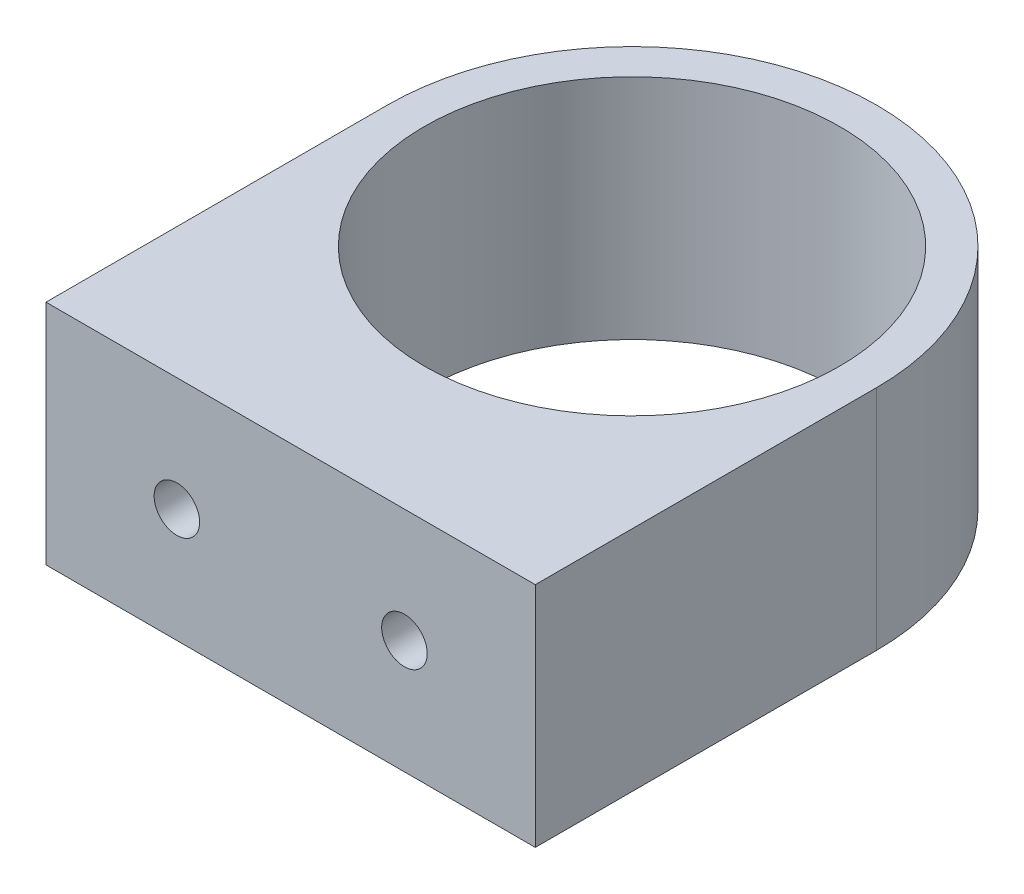
ISO-10303-21;
HEADER;
FILE_DESCRIPTION(('STEP AP214'),'2;1');
FILE_NAME('part.step','',(''),(''),'','','');
FILE_SCHEMA(('AUTOMOTIVE_DESIGN { 1 0 10303 214 1 1 1 1 }'));
ENDSEC;
DATA;
#1=APPLICATION_CONTEXT('core data for automotive mechanical design processes');
#2=APPLICATION_PROTOCOL_DEFINITION('international standard','automotive_design',2000,#1);
#3=PRODUCT_CONTEXT('',#1,'mechanical');
#4=PRODUCT('Part','Part','',(#3));
#5=PRODUCT_RELATED_PRODUCT_CATEGORY('part','',(#4));
#6=PRODUCT_DEFINITION_FORMATION('','',#4);
#7=PRODUCT_DEFINITION_CONTEXT('part definition',#1,'design');
#8=PRODUCT_DEFINITION('design','',#6,#7);
#9=PRODUCT_DEFINITION_SHAPE('','',#8);
#10=(LENGTH_UNIT() NAMED_UNIT(*) SI_UNIT(.MILLI.,.METRE.));
#11=(NAMED_UNIT(*) PLANE_ANGLE_UNIT() SI_UNIT($,.RADIAN.));
#12=(NAMED_UNIT(*) SI_UNIT($,.STERADIAN.) SOLID_ANGLE_UNIT());
#13=UNCERTAINTY_MEASURE_WITH_UNIT(LENGTH_MEASURE(1.E-05),#10,'distance_accuracy_value','');
#14=(GEOMETRIC_REPRESENTATION_CONTEXT(3) GLOBAL_UNCERTAINTY_ASSIGNED_CONTEXT((#13)) GLOBAL_UNIT_ASSIGNED_CONTEXT((#10,
#11,#12)) REPRESENTATION_CONTEXT('',''));
#15=CARTESIAN_POINT('',(0.,0.,0.));
#16=DIRECTION('',(0.,0.,1.));
#17=DIRECTION('',(1.,0.,0.));
#18=AXIS2_PLACEMENT_3D('',#15,#16,#17);
#19=CARTESIAN_POINT('',(21.5,20.,0.));
#20=DIRECTION('',(-1.,0.,0.));
#21=DIRECTION('',(0.,0.,1.));
#22=AXIS2_PLACEMENT_3D('',#19,#20,#21);
#23=PLANE('',#22);
#24=DIRECTION('',(0.,0.,-1.));
#25=VECTOR('',#24,1.);
#26=CARTESIAN_POINT('',(21.5,0.,0.));
#27=LINE('',#26,#25);
#28=CARTESIAN_POINT('',(21.5,0.,30.));
#29=VERTEX_POINT('',#28);
#30=CARTESIAN_POINT('',(21.5,0.,0.));
#31=VERTEX_POINT('',#30);
#32=EDGE_CURVE('E107',#29,#31,#27,.T.);
#33=ORIENTED_EDGE('',*,*,#32,.T.);
#34=DIRECTION('',(0.,-1.,0.));
#35=VECTOR('',#34,1.);
#36=CARTESIAN_POINT('',(21.5,20.,0.));
#37=LINE('',#36,#35);
#38=CARTESIAN_POINT('',(21.5,20.,0.));
#39=VERTEX_POINT('',#38);
#40=EDGE_CURVE('E11',#39,#31,#37,.T.);
#41=ORIENTED_EDGE('',*,*,#40,.F.);
#42=DIRECTION('',(0.,0.,-1.));
#43=VECTOR('',#42,1.);
#44=CARTESIAN_POINT('',(21.5,20.,0.));
#45=LINE('',#44,#43);
#46=CARTESIAN_POINT('',(21.5,20.,30.));
#47=VERTEX_POINT('',#46);
#48=EDGE_CURVE('E91',#47,#39,#45,.T.);
#49=ORIENTED_EDGE('',*,*,#48,.F.);
#50=DIRECTION('',(0.,-1.,0.));
#51=VECTOR('',#50,1.);
#52=CARTESIAN_POINT('',(21.5,20.,30.));
#53=LINE('',#52,#51);
#54=EDGE_CURVE('E110',#47,#29,#53,.T.);
#55=ORIENTED_EDGE('',*,*,#54,.T.);
#56=EDGE_LOOP('',(#33,#41,#49,#55));
#57=FACE_BOUND('',#56,.T.);
#58=ADVANCED_FACE('F41',(#57),#23,.F.);
#59=CARTESIAN_POINT('',(0.,20.,0.));
#60=DIRECTION('',(0.,-1.,0.));
#61=DIRECTION('',(0.,0.,-1.));
#62=AXIS2_PLACEMENT_3D('',#59,#60,#61);
#63=CYLINDRICAL_SURFACE('',#62,21.5);
#64=CARTESIAN_POINT('',(0.,0.,0.));
#65=DIRECTION('',(0.,1.,0.));
#66=DIRECTION('',(0.,0.,1.));
#67=AXIS2_PLACEMENT_3D('',#64,#65,#66);
#68=CIRCLE('',#67,21.5);
#69=CARTESIAN_POINT('',(-21.5,0.,0.));
#70=VERTEX_POINT('',#69);
#71=EDGE_CURVE('E100',#31,#70,#68,.T.);
#72=ORIENTED_EDGE('',*,*,#71,.T.);
#73=DIRECTION('',(0.,-1.,0.));
#74=VECTOR('',#73,1.);
#75=CARTESIAN_POINT('',(-21.5,20.,0.));
#76=LINE('',#75,#74);
#77=CARTESIAN_POINT('',(-21.5,20.,0.));
#78=VERTEX_POINT('',#77);
#79=EDGE_CURVE('E47',#78,#70,#76,.T.);
#80=ORIENTED_EDGE('',*,*,#79,.F.);
#81=CARTESIAN_POINT('',(0.,20.,0.));
#82=DIRECTION('',(0.,1.,0.));
#83=DIRECTION('',(0.,0.,1.));
#84=AXIS2_PLACEMENT_3D('',#81,#82,#83);
#85=CIRCLE('',#84,21.5);
#86=EDGE_CURVE('E87',#39,#78,#85,.T.);
#87=ORIENTED_EDGE('',*,*,#86,.F.);
#88=ORIENTED_EDGE('',*,*,#40,.T.);
#89=EDGE_LOOP('',(#72,#80,#87,#88));
#90=FACE_BOUND('',#89,.T.);
#91=ADVANCED_FACE('F96',(#90),#63,.T.);
#92=CARTESIAN_POINT('',(-21.5,20.,0.));
#93=DIRECTION('',(1.,0.,0.));
#94=DIRECTION('',(0.,0.,-1.));
#95=AXIS2_PLACEMENT_3D('',#92,#93,#94);
#96=PLANE('',#95);
#97=DIRECTION('',(0.,0.,1.));
#98=VECTOR('',#97,1.);
#99=CARTESIAN_POINT('',(-21.5,0.,0.));
#100=LINE('',#99,#98);
#101=CARTESIAN_POINT('',(-21.5,0.,30.));
#102=VERTEX_POINT('',#101);
#103=EDGE_CURVE('E74',#70,#102,#100,.T.);
#104=ORIENTED_EDGE('',*,*,#103,.T.);
#105=DIRECTION('',(0.,-1.,0.));
#106=VECTOR('',#105,1.);
#107=CARTESIAN_POINT('',(-21.5,20.,30.));
#108=LINE('',#107,#106);
#109=CARTESIAN_POINT('',(-21.5,20.,30.));
#110=VERTEX_POINT('',#109);
#111=EDGE_CURVE('E98',#110,#102,#108,.T.);
#112=ORIENTED_EDGE('',*,*,#111,.F.);
#113=DIRECTION('',(0.,0.,1.));
#114=VECTOR('',#113,1.);
#115=CARTESIAN_POINT('',(-21.5,20.,0.));
#116=LINE('',#115,#114);
#117=EDGE_CURVE('E93',#78,#110,#116,.T.);
#118=ORIENTED_EDGE('',*,*,#117,.F.);
#119=ORIENTED_EDGE('',*,*,#79,.T.);
#120=EDGE_LOOP('',(#104,#112,#118,#119));
#121=FACE_BOUND('',#120,.T.);
#122=ADVANCED_FACE('F97',(#121),#96,.F.);
#123=CARTESIAN_POINT('',(0.,20.,30.));
#124=DIRECTION('',(0.,0.,-1.));
#125=DIRECTION('',(-1.,0.,0.));
#126=AXIS2_PLACEMENT_3D('',#123,#124,#125);
#127=PLANE('',#126);
#128=CARTESIAN_POINT('',(-10.,10.,30.));
#129=DIRECTION('',(0.,0.,1.));
#130=DIRECTION('',(1.,0.,0.));
#131=AXIS2_PLACEMENT_3D('',#128,#129,#130);
#132=CIRCLE('',#131,2.);
#133=CARTESIAN_POINT('',(-8.,10.,30.));
#134=VERTEX_POINT('',#133);
#135=EDGE_CURVE('E135',#134,#134,#132,.T.);
#136=ORIENTED_EDGE('',*,*,#135,.F.);
#137=EDGE_LOOP('',(#136));
#138=FACE_BOUND('',#137,.T.);
#139=CARTESIAN_POINT('',(10.,10.,30.));
#140=DIRECTION('',(0.,0.,1.));
#141=DIRECTION('',(1.,0.,0.));
#142=AXIS2_PLACEMENT_3D('',#139,#140,#141);
#143=CIRCLE('',#142,2.);
#144=CARTESIAN_POINT('',(12.,10.,30.));
#145=VERTEX_POINT('',#144);
#146=EDGE_CURVE('E129',#145,#145,#143,.T.);
#147=ORIENTED_EDGE('',*,*,#146,.F.);
#148=EDGE_LOOP('',(#147));
#149=FACE_BOUND('',#148,.T.);
#150=DIRECTION('',(1.,0.,0.));
#151=VECTOR('',#150,1.);
#152=CARTESIAN_POINT('',(0.,0.,30.));
#153=LINE('',#152,#151);
#154=EDGE_CURVE('E78',#102,#29,#153,.T.);
#155=ORIENTED_EDGE('',*,*,#154,.T.);
#156=ORIENTED_EDGE('',*,*,#54,.F.);
#157=DIRECTION('',(1.,0.,0.));
#158=VECTOR('',#157,1.);
#159=CARTESIAN_POINT('',(0.,20.,30.));
#160=LINE('',#159,#158);
#161=EDGE_CURVE('E60',#110,#47,#160,.T.);
#162=ORIENTED_EDGE('',*,*,#161,.F.);
#163=ORIENTED_EDGE('',*,*,#111,.T.);
#164=EDGE_LOOP('',(#155,#156,#162,#163));
#165=FACE_BOUND('',#164,.T.);
#166=ADVANCED_FACE('F116',(#138,#149,#165),#127,.F.);
#167=CARTESIAN_POINT('',(0.,20.,0.));
#168=DIRECTION('',(0.,-1.,0.));
#169=DIRECTION('',(0.,0.,-1.));
#170=AXIS2_PLACEMENT_3D('',#167,#168,#169);
#171=CYLINDRICAL_SURFACE('',#170,18.25);
#172=CARTESIAN_POINT('',(0.,20.,0.));
#173=DIRECTION('',(0.,1.,0.));
#174=DIRECTION('',(0.,0.,1.));
#175=AXIS2_PLACEMENT_3D('',#172,#173,#174);
#176=CIRCLE('',#175,18.25);
#177=CARTESIAN_POINT('',(0.,20.,18.25));
#178=VERTEX_POINT('',#177);
#179=EDGE_CURVE('E101',#178,#178,#176,.T.);
#180=ORIENTED_EDGE('',*,*,#179,.T.);
#181=EDGE_LOOP('',(#180));
#182=FACE_BOUND('',#181,.T.);
#183=CARTESIAN_POINT('',(0.,0.,0.));
#184=DIRECTION('',(0.,1.,0.));
#185=DIRECTION('',(0.,0.,1.));
#186=AXIS2_PLACEMENT_3D('',#183,#184,#185);
#187=CIRCLE('',#186,18.25);
#188=CARTESIAN_POINT('',(0.,0.,18.25));
#189=VERTEX_POINT('',#188);
#190=EDGE_CURVE('E113',#189,#189,#187,.T.);
#191=ORIENTED_EDGE('',*,*,#190,.F.);
#192=EDGE_LOOP('',(#191));
#193=FACE_BOUND('',#192,.T.);
#194=ADVANCED_FACE('F149',(#182,#193),#171,.F.);
#195=CARTESIAN_POINT('',(0.,20.,0.));
#196=DIRECTION('',(0.,1.,0.));
#197=DIRECTION('',(0.,0.,1.));
#198=AXIS2_PLACEMENT_3D('',#195,#196,#197);
#199=PLANE('',#198);
#200=ORIENTED_EDGE('',*,*,#48,.T.);
#201=ORIENTED_EDGE('',*,*,#86,.T.);
#202=ORIENTED_EDGE('',*,*,#117,.T.);
#203=ORIENTED_EDGE('',*,*,#161,.T.);
#204=EDGE_LOOP('',(#200,#201,#202,#203));
#205=FACE_BOUND('',#204,.T.);
#206=ORIENTED_EDGE('',*,*,#179,.F.);
#207=EDGE_LOOP('',(#206));
#208=FACE_BOUND('',#207,.T.);
#209=ADVANCED_FACE('F86',(#205,#208),#199,.T.);
#210=CARTESIAN_POINT('',(0.,0.,0.));
#211=DIRECTION('',(0.,1.,0.));
#212=DIRECTION('',(0.,0.,1.));
#213=AXIS2_PLACEMENT_3D('',#210,#211,#212);
#214=PLANE('',#213);
#215=ORIENTED_EDGE('',*,*,#32,.F.);
#216=ORIENTED_EDGE('',*,*,#154,.F.);
#217=ORIENTED_EDGE('',*,*,#103,.F.);
#218=ORIENTED_EDGE('',*,*,#71,.F.);
#219=EDGE_LOOP('',(#215,#216,#217,#218));
#220=FACE_BOUND('',#219,.T.);
#221=ORIENTED_EDGE('',*,*,#190,.T.);
#222=EDGE_LOOP('',(#221));
#223=FACE_BOUND('',#222,.T.);
#224=ADVANCED_FACE('F124',(#220,#223),#214,.F.);
#225=CARTESIAN_POINT('',(10.,10.,20.));
#226=DIRECTION('',(0.,0.,1.));
#227=DIRECTION('',(1.,0.,0.));
#228=AXIS2_PLACEMENT_3D('',#225,#226,#227);
#229=CYLINDRICAL_SURFACE('',#228,2.);
#230=CARTESIAN_POINT('',(10.,10.,20.));
#231=DIRECTION('',(0.,0.,1.));
#232=DIRECTION('',(1.,0.,0.));
#233=AXIS2_PLACEMENT_3D('',#230,#231,#232);
#234=CIRCLE('',#233,2.);
#235=CARTESIAN_POINT('',(12.,10.,20.));
#236=VERTEX_POINT('',#235);
#237=EDGE_CURVE('E127',#236,#236,#234,.T.);
#238=ORIENTED_EDGE('',*,*,#237,.F.);
#239=EDGE_LOOP('',(#238));
#240=FACE_BOUND('',#239,.T.);
#241=ORIENTED_EDGE('',*,*,#146,.T.);
#242=EDGE_LOOP('',(#241));
#243=FACE_BOUND('',#242,.T.);
#244=ADVANCED_FACE('F153',(#240,#243),#229,.F.);
#245=CARTESIAN_POINT('',(10.,10.,20.));
#246=DIRECTION('',(0.,0.,1.));
#247=DIRECTION('',(1.,0.,0.));
#248=AXIS2_PLACEMENT_3D('',#245,#246,#247);
#249=PLANE('',#248);
#250=ORIENTED_EDGE('',*,*,#237,.T.);
#251=EDGE_LOOP('',(#250));
#252=FACE_BOUND('',#251,.T.);
#253=ADVANCED_FACE('F141',(#252),#249,.T.);
#254=CARTESIAN_POINT('',(-10.,10.,20.));
#255=DIRECTION('',(0.,0.,1.));
#256=DIRECTION('',(1.,0.,0.));
#257=AXIS2_PLACEMENT_3D('',#254,#255,#256);
#258=CYLINDRICAL_SURFACE('',#257,2.);
#259=CARTESIAN_POINT('',(-10.,10.,20.));
#260=DIRECTION('',(0.,0.,1.));
#261=DIRECTION('',(1.,0.,0.));
#262=AXIS2_PLACEMENT_3D('',#259,#260,#261);
#263=CIRCLE('',#262,2.);
#264=CARTESIAN_POINT('',(-8.,10.,20.));
#265=VERTEX_POINT('',#264);
#266=EDGE_CURVE('E112',#265,#265,#263,.T.);
#267=ORIENTED_EDGE('',*,*,#266,.F.);
#268=EDGE_LOOP('',(#267));
#269=FACE_BOUND('',#268,.T.);
#270=ORIENTED_EDGE('',*,*,#135,.T.);
#271=EDGE_LOOP('',(#270));
#272=FACE_BOUND('',#271,.T.);
#273=ADVANCED_FACE('F138',(#269,#272),#258,.F.);
#274=CARTESIAN_POINT('',(-10.,10.,20.));
#275=DIRECTION('',(0.,0.,1.));
#276=DIRECTION('',(1.,0.,0.));
#277=AXIS2_PLACEMENT_3D('',#274,#275,#276);
#278=PLANE('',#277);
#279=ORIENTED_EDGE('',*,*,#266,.T.);
#280=EDGE_LOOP('',(#279));
#281=FACE_BOUND('',#280,.T.);
#282=ADVANCED_FACE('F140',(#281),#278,.T.);
#283=CLOSED_SHELL('',(#58,#91,#122,#166,#194,#209,#224,#244,#253,#273,#282));
#284=MANIFOLD_SOLID_BREP('B2',#283);
#285=ADVANCED_BREP_SHAPE_REPRESENTATION('',(#18,#284),#14);
#286=SHAPE_DEFINITION_REPRESENTATION(#9,#285);
ENDSEC;
END-ISO-10303-21;
